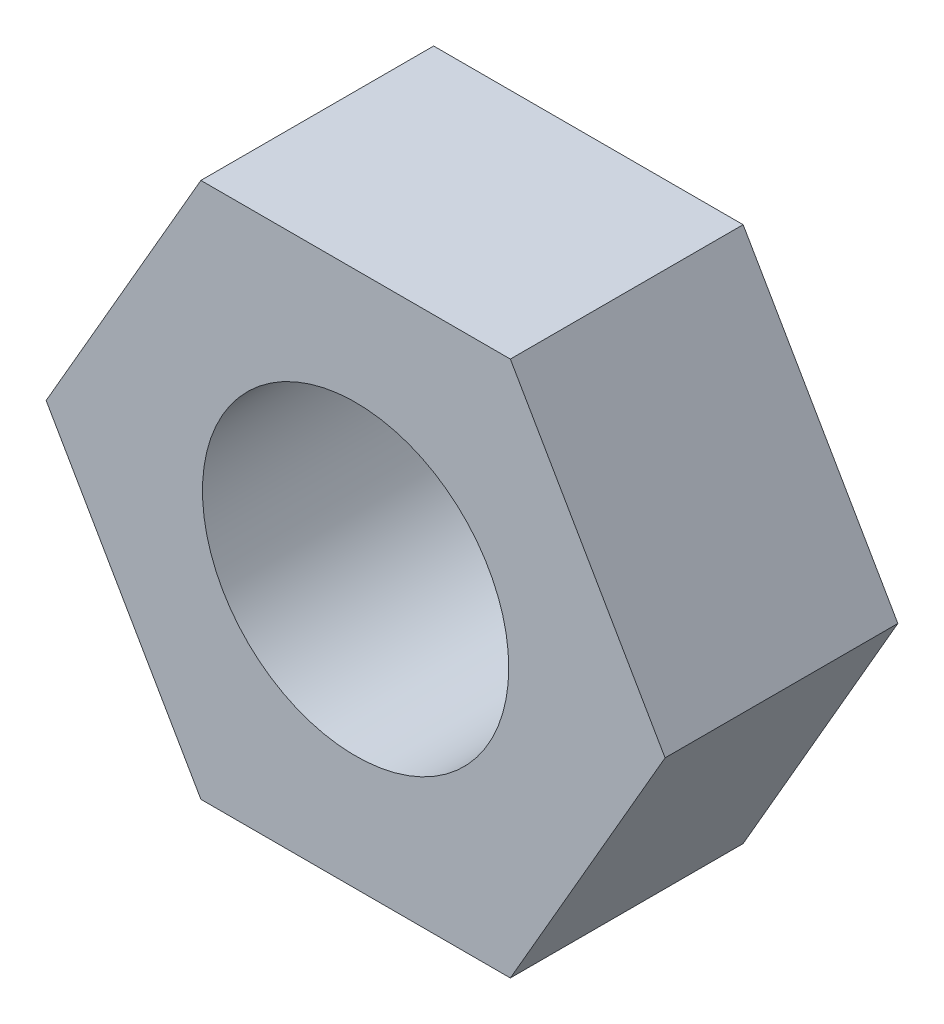
ISO-10303-21;
HEADER;
FILE_DESCRIPTION(('STEP AP214'),'2;1');
FILE_NAME('part.step','',(''),(''),'','','');
FILE_SCHEMA(('AUTOMOTIVE_DESIGN { 1 0 10303 214 1 1 1 1 }'));
ENDSEC;
DATA;
#1=APPLICATION_CONTEXT('core data for automotive mechanical design processes');
#2=APPLICATION_PROTOCOL_DEFINITION('international standard','automotive_design',2000,#1);
#3=PRODUCT_CONTEXT('',#1,'mechanical');
#4=PRODUCT('Part','Part','',(#3));
#5=PRODUCT_RELATED_PRODUCT_CATEGORY('part','',(#4));
#6=PRODUCT_DEFINITION_FORMATION('','',#4);
#7=PRODUCT_DEFINITION_CONTEXT('part definition',#1,'design');
#8=PRODUCT_DEFINITION('design','',#6,#7);
#9=PRODUCT_DEFINITION_SHAPE('','',#8);
#10=(LENGTH_UNIT() NAMED_UNIT(*) SI_UNIT(.MILLI.,.METRE.));
#11=(NAMED_UNIT(*) PLANE_ANGLE_UNIT() SI_UNIT($,.RADIAN.));
#12=(NAMED_UNIT(*) SI_UNIT($,.STERADIAN.) SOLID_ANGLE_UNIT());
#13=UNCERTAINTY_MEASURE_WITH_UNIT(LENGTH_MEASURE(1.E-05),#10,'distance_accuracy_value','');
#14=(GEOMETRIC_REPRESENTATION_CONTEXT(3) GLOBAL_UNCERTAINTY_ASSIGNED_CONTEXT((#13)) GLOBAL_UNIT_ASSIGNED_CONTEXT((#10,
#11,#12)) REPRESENTATION_CONTEXT('',''));
#15=CARTESIAN_POINT('',(0.,0.,0.));
#16=DIRECTION('',(0.,0.,1.));
#17=DIRECTION('',(1.,0.,0.));
#18=AXIS2_PLACEMENT_3D('',#15,#16,#17);
#19=CARTESIAN_POINT('',(-3.20790243318486,5.55625,4.826));
#20=DIRECTION('',(0.866025403784439,-0.5,0.));
#21=DIRECTION('',(0.5,0.866025403784439,0.));
#22=AXIS2_PLACEMENT_3D('',#19,#20,#21);
#23=PLANE('',#22);
#24=DIRECTION('',(-0.5,-0.866025403784438,0.));
#25=VECTOR('',#24,1.);
#26=CARTESIAN_POINT('',(-3.20790243318486,5.55625,0.));
#27=LINE('',#26,#25);
#28=CARTESIAN_POINT('',(-3.20790243318486,5.55625,0.));
#29=VERTEX_POINT('',#28);
#30=CARTESIAN_POINT('',(-6.41580486636972,0.,0.));
#31=VERTEX_POINT('',#30);
#32=EDGE_CURVE('E132',#29,#31,#27,.T.);
#33=ORIENTED_EDGE('',*,*,#32,.T.);
#34=DIRECTION('',(0.,0.,-1.));
#35=VECTOR('',#34,1.);
#36=CARTESIAN_POINT('',(-6.41580486636972,0.,4.826));
#37=LINE('',#36,#35);
#38=CARTESIAN_POINT('',(-6.41580486636972,0.,4.826));
#39=VERTEX_POINT('',#38);
#40=EDGE_CURVE('E11',#39,#31,#37,.T.);
#41=ORIENTED_EDGE('',*,*,#40,.F.);
#42=DIRECTION('',(-0.5,-0.866025403784438,0.));
#43=VECTOR('',#42,1.);
#44=CARTESIAN_POINT('',(-3.20790243318486,5.55625,4.826));
#45=LINE('',#44,#43);
#46=CARTESIAN_POINT('',(-3.20790243318486,5.55625,4.826));
#47=VERTEX_POINT('',#46);
#48=EDGE_CURVE('E149',#47,#39,#45,.T.);
#49=ORIENTED_EDGE('',*,*,#48,.F.);
#50=DIRECTION('',(0.,0.,-1.));
#51=VECTOR('',#50,1.);
#52=CARTESIAN_POINT('',(-3.20790243318486,5.55625,4.826));
#53=LINE('',#52,#51);
#54=EDGE_CURVE('E128',#47,#29,#53,.T.);
#55=ORIENTED_EDGE('',*,*,#54,.T.);
#56=EDGE_LOOP('',(#33,#41,#49,#55));
#57=FACE_BOUND('',#56,.T.);
#58=ADVANCED_FACE('F43',(#57),#23,.F.);
#59=CARTESIAN_POINT('',(-6.41580486636972,0.,4.826));
#60=DIRECTION('',(0.866025403784439,0.5,0.));
#61=DIRECTION('',(-0.5,0.866025403784439,0.));
#62=AXIS2_PLACEMENT_3D('',#59,#60,#61);
#63=PLANE('',#62);
#64=DIRECTION('',(0.5,-0.866025403784439,0.));
#65=VECTOR('',#64,1.);
#66=CARTESIAN_POINT('',(-6.41580486636972,0.,0.));
#67=LINE('',#66,#65);
#68=CARTESIAN_POINT('',(-3.20790243318486,-5.55625,0.));
#69=VERTEX_POINT('',#68);
#70=EDGE_CURVE('E136',#31,#69,#67,.T.);
#71=ORIENTED_EDGE('',*,*,#70,.T.);
#72=DIRECTION('',(0.,0.,-1.));
#73=VECTOR('',#72,1.);
#74=CARTESIAN_POINT('',(-3.20790243318486,-5.55625,4.826));
#75=LINE('',#74,#73);
#76=CARTESIAN_POINT('',(-3.20790243318486,-5.55625,4.826));
#77=VERTEX_POINT('',#76);
#78=EDGE_CURVE('E52',#77,#69,#75,.T.);
#79=ORIENTED_EDGE('',*,*,#78,.F.);
#80=DIRECTION('',(0.5,-0.866025403784439,0.));
#81=VECTOR('',#80,1.);
#82=CARTESIAN_POINT('',(-6.41580486636972,0.,4.826));
#83=LINE('',#82,#81);
#84=EDGE_CURVE('E97',#39,#77,#83,.T.);
#85=ORIENTED_EDGE('',*,*,#84,.F.);
#86=ORIENTED_EDGE('',*,*,#40,.T.);
#87=EDGE_LOOP('',(#71,#79,#85,#86));
#88=FACE_BOUND('',#87,.T.);
#89=ADVANCED_FACE('F178',(#88),#63,.F.);
#90=CARTESIAN_POINT('',(-3.20790243318486,-5.55625,4.826));
#91=DIRECTION('',(0.,1.,0.));
#92=DIRECTION('',(-1.,0.,0.));
#93=AXIS2_PLACEMENT_3D('',#90,#91,#92);
#94=PLANE('',#93);
#95=DIRECTION('',(1.,0.,0.));
#96=VECTOR('',#95,1.);
#97=CARTESIAN_POINT('',(-3.20790243318486,-5.55625,0.));
#98=LINE('',#97,#96);
#99=CARTESIAN_POINT('',(3.20790243318486,-5.55625,0.));
#100=VERTEX_POINT('',#99);
#101=EDGE_CURVE('E140',#69,#100,#98,.T.);
#102=ORIENTED_EDGE('',*,*,#101,.T.);
#103=DIRECTION('',(0.,0.,-1.));
#104=VECTOR('',#103,1.);
#105=CARTESIAN_POINT('',(3.20790243318486,-5.55625,4.826));
#106=LINE('',#105,#104);
#107=CARTESIAN_POINT('',(3.20790243318486,-5.55625,4.826));
#108=VERTEX_POINT('',#107);
#109=EDGE_CURVE('E121',#108,#100,#106,.T.);
#110=ORIENTED_EDGE('',*,*,#109,.F.);
#111=DIRECTION('',(1.,0.,0.));
#112=VECTOR('',#111,1.);
#113=CARTESIAN_POINT('',(-3.20790243318486,-5.55625,4.826));
#114=LINE('',#113,#112);
#115=EDGE_CURVE('E110',#77,#108,#114,.T.);
#116=ORIENTED_EDGE('',*,*,#115,.F.);
#117=ORIENTED_EDGE('',*,*,#78,.T.);
#118=EDGE_LOOP('',(#102,#110,#116,#117));
#119=FACE_BOUND('',#118,.T.);
#120=ADVANCED_FACE('F159',(#119),#94,.F.);
#121=CARTESIAN_POINT('',(3.20790243318486,-5.55625,4.826));
#122=DIRECTION('',(-0.866025403784439,0.5,0.));
#123=DIRECTION('',(-0.5,-0.866025403784439,0.));
#124=AXIS2_PLACEMENT_3D('',#121,#122,#123);
#125=PLANE('',#124);
#126=DIRECTION('',(0.5,0.866025403784439,0.));
#127=VECTOR('',#126,1.);
#128=CARTESIAN_POINT('',(3.20790243318486,-5.55625,0.));
#129=LINE('',#128,#127);
#130=CARTESIAN_POINT('',(6.41580486636971,0.,0.));
#131=VERTEX_POINT('',#130);
#132=EDGE_CURVE('E119',#100,#131,#129,.T.);
#133=ORIENTED_EDGE('',*,*,#132,.T.);
#134=DIRECTION('',(0.,0.,-1.));
#135=VECTOR('',#134,1.);
#136=CARTESIAN_POINT('',(6.41580486636971,0.,4.826));
#137=LINE('',#136,#135);
#138=CARTESIAN_POINT('',(6.41580486636971,0.,4.826));
#139=VERTEX_POINT('',#138);
#140=EDGE_CURVE('E116',#139,#131,#137,.T.);
#141=ORIENTED_EDGE('',*,*,#140,.F.);
#142=DIRECTION('',(0.5,0.866025403784439,0.));
#143=VECTOR('',#142,1.);
#144=CARTESIAN_POINT('',(3.20790243318486,-5.55625,4.826));
#145=LINE('',#144,#143);
#146=EDGE_CURVE('E104',#108,#139,#145,.T.);
#147=ORIENTED_EDGE('',*,*,#146,.F.);
#148=ORIENTED_EDGE('',*,*,#109,.T.);
#149=EDGE_LOOP('',(#133,#141,#147,#148));
#150=FACE_BOUND('',#149,.T.);
#151=ADVANCED_FACE('F117',(#150),#125,.F.);
#152=CARTESIAN_POINT('',(6.41580486636971,0.,4.826));
#153=DIRECTION('',(-0.866025403784439,-0.5,0.));
#154=DIRECTION('',(0.5,-0.866025403784439,0.));
#155=AXIS2_PLACEMENT_3D('',#152,#153,#154);
#156=PLANE('',#155);
#157=DIRECTION('',(-0.5,0.866025403784439,0.));
#158=VECTOR('',#157,1.);
#159=CARTESIAN_POINT('',(6.41580486636971,0.,0.));
#160=LINE('',#159,#158);
#161=CARTESIAN_POINT('',(3.20790243318486,5.55625,0.));
#162=VERTEX_POINT('',#161);
#163=EDGE_CURVE('E83',#131,#162,#160,.T.);
#164=ORIENTED_EDGE('',*,*,#163,.T.);
#165=DIRECTION('',(0.,0.,-1.));
#166=VECTOR('',#165,1.);
#167=CARTESIAN_POINT('',(3.20790243318486,5.55625,4.826));
#168=LINE('',#167,#166);
#169=CARTESIAN_POINT('',(3.20790243318486,5.55625,4.826));
#170=VERTEX_POINT('',#169);
#171=EDGE_CURVE('E122',#170,#162,#168,.T.);
#172=ORIENTED_EDGE('',*,*,#171,.F.);
#173=DIRECTION('',(-0.5,0.866025403784439,0.));
#174=VECTOR('',#173,1.);
#175=CARTESIAN_POINT('',(6.41580486636971,0.,4.826));
#176=LINE('',#175,#174);
#177=EDGE_CURVE('E108',#139,#170,#176,.T.);
#178=ORIENTED_EDGE('',*,*,#177,.F.);
#179=ORIENTED_EDGE('',*,*,#140,.T.);
#180=EDGE_LOOP('',(#164,#172,#178,#179));
#181=FACE_BOUND('',#180,.T.);
#182=ADVANCED_FACE('F124',(#181),#156,.F.);
#183=CARTESIAN_POINT('',(3.20790243318486,5.55625,4.826));
#184=DIRECTION('',(0.,-1.,0.));
#185=DIRECTION('',(1.,0.,0.));
#186=AXIS2_PLACEMENT_3D('',#183,#184,#185);
#187=PLANE('',#186);
#188=DIRECTION('',(-1.,0.,0.));
#189=VECTOR('',#188,1.);
#190=CARTESIAN_POINT('',(3.20790243318486,5.55625,0.));
#191=LINE('',#190,#189);
#192=EDGE_CURVE('E89',#162,#29,#191,.T.);
#193=ORIENTED_EDGE('',*,*,#192,.T.);
#194=ORIENTED_EDGE('',*,*,#54,.F.);
#195=DIRECTION('',(-1.,0.,0.));
#196=VECTOR('',#195,1.);
#197=CARTESIAN_POINT('',(3.20790243318486,5.55625,4.826));
#198=LINE('',#197,#196);
#199=EDGE_CURVE('E60',#170,#47,#198,.T.);
#200=ORIENTED_EDGE('',*,*,#199,.F.);
#201=ORIENTED_EDGE('',*,*,#171,.T.);
#202=EDGE_LOOP('',(#193,#194,#200,#201));
#203=FACE_BOUND('',#202,.T.);
#204=ADVANCED_FACE('F166',(#203),#187,.F.);
#205=CARTESIAN_POINT('',(0.,0.,4.826));
#206=DIRECTION('',(0.,0.,1.));
#207=DIRECTION('',(1.,0.,0.));
#208=AXIS2_PLACEMENT_3D('',#205,#206,#207);
#209=PLANE('',#208);
#210=CARTESIAN_POINT('',(0.,0.,4.826));
#211=DIRECTION('',(0.,0.,1.));
#212=DIRECTION('',(1.,0.,0.));
#213=AXIS2_PLACEMENT_3D('',#210,#211,#212);
#214=CIRCLE('',#213,3.175);
#215=CARTESIAN_POINT('',(3.175,0.,4.826));
#216=VERTEX_POINT('',#215);
#217=EDGE_CURVE('E265',#216,#216,#214,.T.);
#218=ORIENTED_EDGE('',*,*,#217,.F.);
#219=EDGE_LOOP('',(#218));
#220=FACE_BOUND('',#219,.T.);
#221=ORIENTED_EDGE('',*,*,#48,.T.);
#222=ORIENTED_EDGE('',*,*,#84,.T.);
#223=ORIENTED_EDGE('',*,*,#115,.T.);
#224=ORIENTED_EDGE('',*,*,#146,.T.);
#225=ORIENTED_EDGE('',*,*,#177,.T.);
#226=ORIENTED_EDGE('',*,*,#199,.T.);
#227=EDGE_LOOP('',(#221,#222,#223,#224,#225,#226));
#228=FACE_BOUND('',#227,.T.);
#229=ADVANCED_FACE('F106',(#220,#228),#209,.T.);
#230=CARTESIAN_POINT('',(0.,0.,0.));
#231=DIRECTION('',(0.,0.,1.));
#232=DIRECTION('',(1.,0.,0.));
#233=AXIS2_PLACEMENT_3D('',#230,#231,#232);
#234=PLANE('',#233);
#235=CARTESIAN_POINT('',(0.,0.,0.));
#236=DIRECTION('',(0.,0.,1.));
#237=DIRECTION('',(1.,0.,0.));
#238=AXIS2_PLACEMENT_3D('',#235,#236,#237);
#239=CIRCLE('',#238,3.175);
#240=CARTESIAN_POINT('',(3.175,0.,0.));
#241=VERTEX_POINT('',#240);
#242=EDGE_CURVE('E137',#241,#241,#239,.T.);
#243=ORIENTED_EDGE('',*,*,#242,.T.);
#244=EDGE_LOOP('',(#243));
#245=FACE_BOUND('',#244,.T.);
#246=ORIENTED_EDGE('',*,*,#32,.F.);
#247=ORIENTED_EDGE('',*,*,#192,.F.);
#248=ORIENTED_EDGE('',*,*,#163,.F.);
#249=ORIENTED_EDGE('',*,*,#132,.F.);
#250=ORIENTED_EDGE('',*,*,#101,.F.);
#251=ORIENTED_EDGE('',*,*,#70,.F.);
#252=EDGE_LOOP('',(#246,#247,#248,#249,#250,#251));
#253=FACE_BOUND('',#252,.T.);
#254=ADVANCED_FACE('F162',(#245,#253),#234,.F.);
#255=CARTESIAN_POINT('',(0.,0.,0.));
#256=DIRECTION('',(0.,0.,1.));
#257=DIRECTION('',(1.,0.,0.));
#258=AXIS2_PLACEMENT_3D('',#255,#256,#257);
#259=CYLINDRICAL_SURFACE('',#258,3.175);
#260=ORIENTED_EDGE('',*,*,#242,.F.);
#261=EDGE_LOOP('',(#260));
#262=FACE_BOUND('',#261,.T.);
#263=ORIENTED_EDGE('',*,*,#217,.T.);
#264=EDGE_LOOP('',(#263));
#265=FACE_BOUND('',#264,.T.);
#266=ADVANCED_FACE('F218',(#262,#265),#259,.F.);
#267=CLOSED_SHELL('',(#58,#89,#120,#151,#182,#204,#229,#254,#266));
#268=MANIFOLD_SOLID_BREP('B2',#267);
#269=ADVANCED_BREP_SHAPE_REPRESENTATION('',(#18,#268),#14);
#270=SHAPE_DEFINITION_REPRESENTATION(#9,#269);
ENDSEC;
END-ISO-10303-21;
